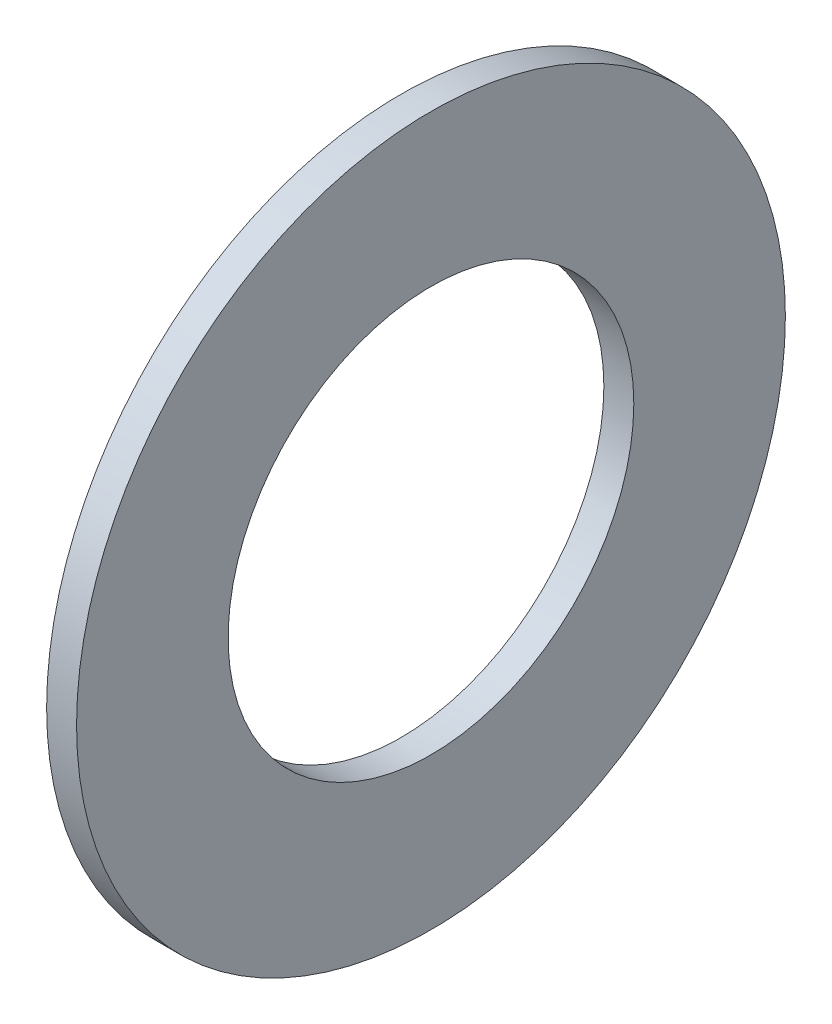
ISO-10303-21;
HEADER;
FILE_DESCRIPTION(('STEP AP214'),'2;1');
FILE_NAME('part.step','',(''),(''),'','','');
FILE_SCHEMA(('AUTOMOTIVE_DESIGN { 1 0 10303 214 1 1 1 1 }'));
ENDSEC;
DATA;
#1=APPLICATION_CONTEXT('core data for automotive mechanical design processes');
#2=APPLICATION_PROTOCOL_DEFINITION('international standard','automotive_design',2000,#1);
#3=PRODUCT_CONTEXT('',#1,'mechanical');
#4=PRODUCT('Part','Part','',(#3));
#5=PRODUCT_RELATED_PRODUCT_CATEGORY('part','',(#4));
#6=PRODUCT_DEFINITION_FORMATION('','',#4);
#7=PRODUCT_DEFINITION_CONTEXT('part definition',#1,'design');
#8=PRODUCT_DEFINITION('design','',#6,#7);
#9=PRODUCT_DEFINITION_SHAPE('','',#8);
#10=(LENGTH_UNIT() NAMED_UNIT(*) SI_UNIT(.MILLI.,.METRE.));
#11=(NAMED_UNIT(*) PLANE_ANGLE_UNIT() SI_UNIT($,.RADIAN.));
#12=(NAMED_UNIT(*) SI_UNIT($,.STERADIAN.) SOLID_ANGLE_UNIT());
#13=UNCERTAINTY_MEASURE_WITH_UNIT(LENGTH_MEASURE(1.E-05),#10,'distance_accuracy_value','');
#14=(GEOMETRIC_REPRESENTATION_CONTEXT(3) GLOBAL_UNCERTAINTY_ASSIGNED_CONTEXT((#13)) GLOBAL_UNIT_ASSIGNED_CONTEXT((#10,
#11,#12)) REPRESENTATION_CONTEXT('',''));
#15=CARTESIAN_POINT('',(0.,0.,0.));
#16=DIRECTION('',(0.,0.,1.));
#17=DIRECTION('',(1.,0.,0.));
#18=AXIS2_PLACEMENT_3D('',#15,#16,#17);
#19=CARTESIAN_POINT('',(4.,0.,0.));
#20=DIRECTION('',(1.,0.,0.));
#21=DIRECTION('',(0.,0.,-1.));
#22=AXIS2_PLACEMENT_3D('',#19,#20,#21);
#23=PLANE('',#22);
#24=CARTESIAN_POINT('',(4.,0.,0.));
#25=DIRECTION('',(1.,0.,0.));
#26=DIRECTION('',(0.,0.,-1.));
#27=AXIS2_PLACEMENT_3D('',#24,#25,#26);
#28=CIRCLE('',#27,47.35);
#29=CARTESIAN_POINT('',(4.,0.,-47.35));
#30=VERTEX_POINT('',#29);
#31=EDGE_CURVE('E10',#30,#30,#28,.T.);
#32=ORIENTED_EDGE('',*,*,#31,.T.);
#33=EDGE_LOOP('',(#32));
#34=FACE_BOUND('',#33,.T.);
#35=CARTESIAN_POINT('',(4.,0.,0.));
#36=DIRECTION('',(1.,0.,0.));
#37=DIRECTION('',(0.,0.,-1.));
#38=AXIS2_PLACEMENT_3D('',#35,#36,#37);
#39=CIRCLE('',#38,27.1);
#40=CARTESIAN_POINT('',(4.,0.,-27.1));
#41=VERTEX_POINT('',#40);
#42=EDGE_CURVE('E45',#41,#41,#39,.T.);
#43=ORIENTED_EDGE('',*,*,#42,.F.);
#44=EDGE_LOOP('',(#43));
#45=FACE_BOUND('',#44,.T.);
#46=ADVANCED_FACE('F34',(#34,#45),#23,.T.);
#47=CARTESIAN_POINT('',(0.,0.,0.));
#48=DIRECTION('',(1.,0.,0.));
#49=DIRECTION('',(0.,0.,-1.));
#50=AXIS2_PLACEMENT_3D('',#47,#48,#49);
#51=PLANE('',#50);
#52=CARTESIAN_POINT('',(0.,0.,0.));
#53=DIRECTION('',(1.,0.,0.));
#54=DIRECTION('',(0.,0.,-1.));
#55=AXIS2_PLACEMENT_3D('',#52,#53,#54);
#56=CIRCLE('',#55,47.35);
#57=CARTESIAN_POINT('',(0.,0.,-47.35));
#58=VERTEX_POINT('',#57);
#59=EDGE_CURVE('E38',#58,#58,#56,.T.);
#60=ORIENTED_EDGE('',*,*,#59,.F.);
#61=EDGE_LOOP('',(#60));
#62=FACE_BOUND('',#61,.T.);
#63=CARTESIAN_POINT('',(0.,0.,0.));
#64=DIRECTION('',(1.,0.,0.));
#65=DIRECTION('',(0.,0.,-1.));
#66=AXIS2_PLACEMENT_3D('',#63,#64,#65);
#67=CIRCLE('',#66,27.1);
#68=CARTESIAN_POINT('',(0.,0.,-27.1));
#69=VERTEX_POINT('',#68);
#70=EDGE_CURVE('E47',#69,#69,#67,.T.);
#71=ORIENTED_EDGE('',*,*,#70,.T.);
#72=EDGE_LOOP('',(#71));
#73=FACE_BOUND('',#72,.T.);
#74=ADVANCED_FACE('F57',(#62,#73),#51,.F.);
#75=CARTESIAN_POINT('',(4.,0.,0.));
#76=DIRECTION('',(-1.,0.,0.));
#77=DIRECTION('',(0.,0.,1.));
#78=AXIS2_PLACEMENT_3D('',#75,#76,#77);
#79=CYLINDRICAL_SURFACE('',#78,47.35);
#80=ORIENTED_EDGE('',*,*,#31,.F.);
#81=EDGE_LOOP('',(#80));
#82=FACE_BOUND('',#81,.T.);
#83=ORIENTED_EDGE('',*,*,#59,.T.);
#84=EDGE_LOOP('',(#83));
#85=FACE_BOUND('',#84,.T.);
#86=ADVANCED_FACE('F36',(#82,#85),#79,.T.);
#87=CARTESIAN_POINT('',(4.,0.,0.));
#88=DIRECTION('',(-1.,0.,0.));
#89=DIRECTION('',(0.,0.,1.));
#90=AXIS2_PLACEMENT_3D('',#87,#88,#89);
#91=CYLINDRICAL_SURFACE('',#90,27.1);
#92=ORIENTED_EDGE('',*,*,#42,.T.);
#93=EDGE_LOOP('',(#92));
#94=FACE_BOUND('',#93,.T.);
#95=ORIENTED_EDGE('',*,*,#70,.F.);
#96=EDGE_LOOP('',(#95));
#97=FACE_BOUND('',#96,.T.);
#98=ADVANCED_FACE('F53',(#94,#97),#91,.F.);
#99=CLOSED_SHELL('',(#46,#74,#86,#98));
#100=MANIFOLD_SOLID_BREP('B2',#99);
#101=ADVANCED_BREP_SHAPE_REPRESENTATION('',(#18,#100),#14);
#102=SHAPE_DEFINITION_REPRESENTATION(#9,#101);
ENDSEC;
END-ISO-10303-21;
